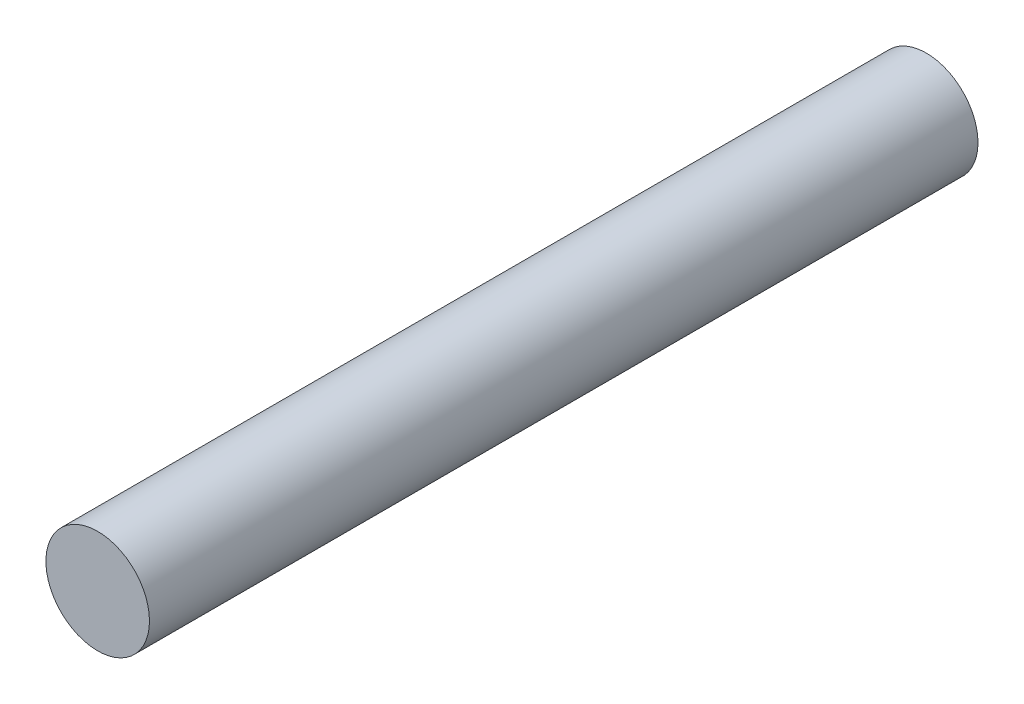
ISO-10303-21;
HEADER;
FILE_DESCRIPTION(('STEP AP214'),'2;1');
FILE_NAME('part.step','',(''),(''),'','','');
FILE_SCHEMA(('AUTOMOTIVE_DESIGN { 1 0 10303 214 1 1 1 1 }'));
ENDSEC;
DATA;
#1=APPLICATION_CONTEXT('core data for automotive mechanical design processes');
#2=APPLICATION_PROTOCOL_DEFINITION('international standard','automotive_design',2000,#1);
#3=PRODUCT_CONTEXT('',#1,'mechanical');
#4=PRODUCT('Part','Part','',(#3));
#5=PRODUCT_RELATED_PRODUCT_CATEGORY('part','',(#4));
#6=PRODUCT_DEFINITION_FORMATION('','',#4);
#7=PRODUCT_DEFINITION_CONTEXT('part definition',#1,'design');
#8=PRODUCT_DEFINITION('design','',#6,#7);
#9=PRODUCT_DEFINITION_SHAPE('','',#8);
#10=(LENGTH_UNIT() NAMED_UNIT(*) SI_UNIT(.MILLI.,.METRE.));
#11=(NAMED_UNIT(*) PLANE_ANGLE_UNIT() SI_UNIT($,.RADIAN.));
#12=(NAMED_UNIT(*) SI_UNIT($,.STERADIAN.) SOLID_ANGLE_UNIT());
#13=UNCERTAINTY_MEASURE_WITH_UNIT(LENGTH_MEASURE(1.E-05),#10,'distance_accuracy_value','');
#14=(GEOMETRIC_REPRESENTATION_CONTEXT(3) GLOBAL_UNCERTAINTY_ASSIGNED_CONTEXT((#13)) GLOBAL_UNIT_ASSIGNED_CONTEXT((#10,
#11,#12)) REPRESENTATION_CONTEXT('',''));
#15=CARTESIAN_POINT('',(0.,0.,0.));
#16=DIRECTION('',(0.,0.,1.));
#17=DIRECTION('',(1.,0.,0.));
#18=AXIS2_PLACEMENT_3D('',#15,#16,#17);
#19=CARTESIAN_POINT('',(0.,0.,20.));
#20=DIRECTION('',(0.,0.,-1.));
#21=DIRECTION('',(-1.,0.,0.));
#22=AXIS2_PLACEMENT_3D('',#19,#20,#21);
#23=CYLINDRICAL_SURFACE('',#22,2.5);
#24=CARTESIAN_POINT('',(0.,0.,20.));
#25=DIRECTION('',(0.,0.,1.));
#26=DIRECTION('',(1.,0.,0.));
#27=AXIS2_PLACEMENT_3D('',#24,#25,#26);
#28=CIRCLE('',#27,2.5);
#29=CARTESIAN_POINT('',(2.5,0.,20.));
#30=VERTEX_POINT('',#29);
#31=EDGE_CURVE('E10',#30,#30,#28,.T.);
#32=ORIENTED_EDGE('',*,*,#31,.F.);
#33=EDGE_LOOP('',(#32));
#34=FACE_BOUND('',#33,.T.);
#35=CARTESIAN_POINT('',(0.,0.,-20.));
#36=DIRECTION('',(0.,0.,1.));
#37=DIRECTION('',(1.,0.,0.));
#38=AXIS2_PLACEMENT_3D('',#35,#36,#37);
#39=CIRCLE('',#38,2.5);
#40=CARTESIAN_POINT('',(2.5,0.,-20.));
#41=VERTEX_POINT('',#40);
#42=EDGE_CURVE('E36',#41,#41,#39,.T.);
#43=ORIENTED_EDGE('',*,*,#42,.T.);
#44=EDGE_LOOP('',(#43));
#45=FACE_BOUND('',#44,.T.);
#46=ADVANCED_FACE('F33',(#34,#45),#23,.T.);
#47=CARTESIAN_POINT('',(0.,0.,20.));
#48=DIRECTION('',(0.,0.,1.));
#49=DIRECTION('',(1.,0.,0.));
#50=AXIS2_PLACEMENT_3D('',#47,#48,#49);
#51=PLANE('',#50);
#52=ORIENTED_EDGE('',*,*,#31,.T.);
#53=EDGE_LOOP('',(#52));
#54=FACE_BOUND('',#53,.T.);
#55=ADVANCED_FACE('F48',(#54),#51,.T.);
#56=CARTESIAN_POINT('',(0.,0.,-20.));
#57=DIRECTION('',(0.,0.,1.));
#58=DIRECTION('',(1.,0.,0.));
#59=AXIS2_PLACEMENT_3D('',#56,#57,#58);
#60=PLANE('',#59);
#61=ORIENTED_EDGE('',*,*,#42,.F.);
#62=EDGE_LOOP('',(#61));
#63=FACE_BOUND('',#62,.T.);
#64=ADVANCED_FACE('F46',(#63),#60,.F.);
#65=CLOSED_SHELL('',(#46,#55,#64));
#66=MANIFOLD_SOLID_BREP('B2',#65);
#67=ADVANCED_BREP_SHAPE_REPRESENTATION('',(#18,#66),#14);
#68=SHAPE_DEFINITION_REPRESENTATION(#9,#67);
ENDSEC;
END-ISO-10303-21;
